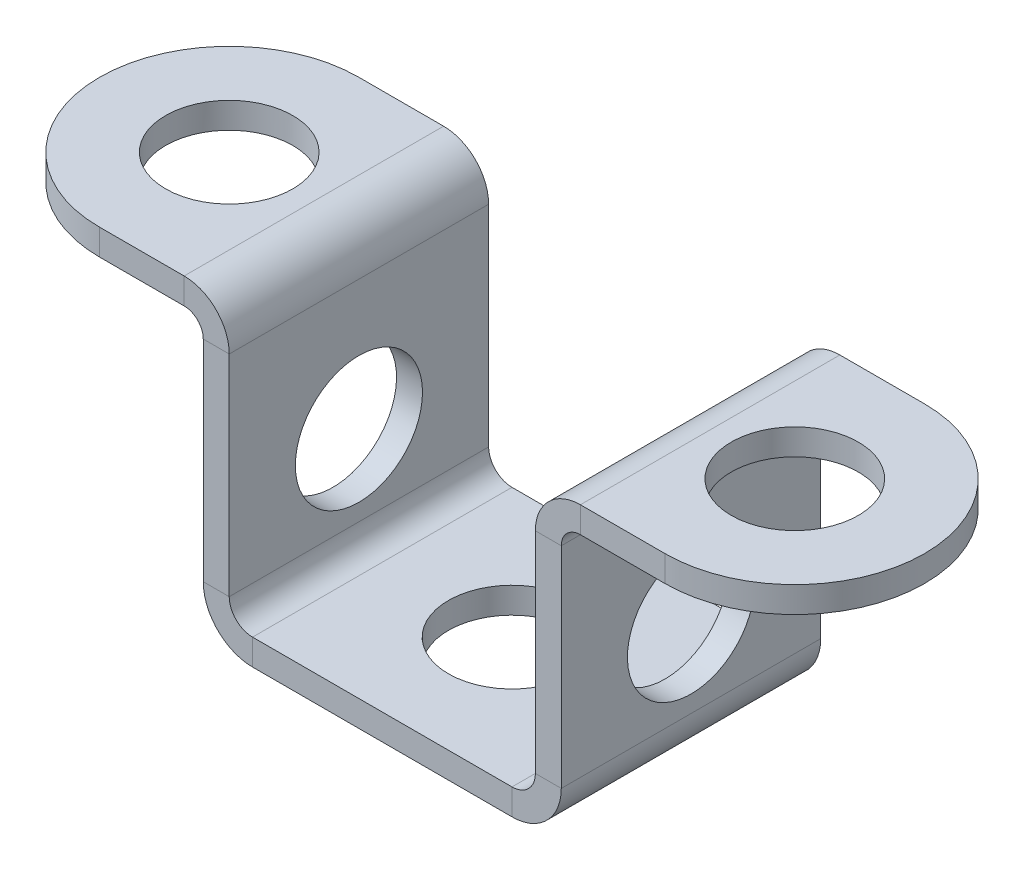
ISO-10303-21;
HEADER;
FILE_DESCRIPTION(('STEP AP214'),'2;1');
FILE_NAME('part.step','',(''),(''),'','','');
FILE_SCHEMA(('AUTOMOTIVE_DESIGN { 1 0 10303 214 1 1 1 1 }'));
ENDSEC;
DATA;
#1=APPLICATION_CONTEXT('core data for automotive mechanical design processes');
#2=APPLICATION_PROTOCOL_DEFINITION('international standard','automotive_design',2000,#1);
#3=PRODUCT_CONTEXT('',#1,'mechanical');
#4=PRODUCT('Part','Part','',(#3));
#5=PRODUCT_RELATED_PRODUCT_CATEGORY('part','',(#4));
#6=PRODUCT_DEFINITION_FORMATION('','',#4);
#7=PRODUCT_DEFINITION_CONTEXT('part definition',#1,'design');
#8=PRODUCT_DEFINITION('design','',#6,#7);
#9=PRODUCT_DEFINITION_SHAPE('','',#8);
#10=(LENGTH_UNIT() NAMED_UNIT(*) SI_UNIT(.MILLI.,.METRE.));
#11=(NAMED_UNIT(*) PLANE_ANGLE_UNIT() SI_UNIT($,.RADIAN.));
#12=(NAMED_UNIT(*) SI_UNIT($,.STERADIAN.) SOLID_ANGLE_UNIT());
#13=UNCERTAINTY_MEASURE_WITH_UNIT(LENGTH_MEASURE(1.E-05),#10,'distance_accuracy_value','');
#14=(GEOMETRIC_REPRESENTATION_CONTEXT(3) GLOBAL_UNCERTAINTY_ASSIGNED_CONTEXT((#13)) GLOBAL_UNIT_ASSIGNED_CONTEXT((#10,
#11,#12)) REPRESENTATION_CONTEXT('',''));
#15=CARTESIAN_POINT('',(0.,0.,0.));
#16=DIRECTION('',(0.,0.,1.));
#17=DIRECTION('',(1.,0.,0.));
#18=AXIS2_PLACEMENT_3D('',#15,#16,#17);
#19=CARTESIAN_POINT('',(0.,11.7366,0.));
#20=DIRECTION('',(0.,1.,0.));
#21=DIRECTION('',(0.,0.,1.));
#22=AXIS2_PLACEMENT_3D('',#19,#20,#21);
#23=PLANE('',#22);
#24=CARTESIAN_POINT('',(10.9,11.7366,0.));
#25=DIRECTION('',(0.,1.,0.));
#26=DIRECTION('',(0.,0.,1.));
#27=AXIS2_PLACEMENT_3D('',#24,#25,#26);
#28=CIRCLE('',#27,2.45);
#29=CARTESIAN_POINT('',(10.9,11.7366,2.45));
#30=VERTEX_POINT('',#29);
#31=EDGE_CURVE('E244',#30,#30,#28,.T.);
#32=ORIENTED_EDGE('',*,*,#31,.F.);
#33=EDGE_LOOP('',(#32));
#34=FACE_BOUND('',#33,.T.);
#35=CARTESIAN_POINT('',(10.9,11.7366,0.));
#36=DIRECTION('',(0.,1.,0.));
#37=DIRECTION('',(0.,0.,1.));
#38=AXIS2_PLACEMENT_3D('',#35,#36,#37);
#39=CIRCLE('',#38,5.);
#40=CARTESIAN_POINT('',(10.9,11.7366,5.));
#41=VERTEX_POINT('',#40);
#42=CARTESIAN_POINT('',(10.9,11.7366,-5.));
#43=VERTEX_POINT('',#42);
#44=EDGE_CURVE('E597',#41,#43,#39,.T.);
#45=ORIENTED_EDGE('',*,*,#44,.T.);
#46=DIRECTION('',(1.,0.,0.));
#47=VECTOR('',#46,1.);
#48=CARTESIAN_POINT('',(15.9,11.7366,-5.));
#49=LINE('',#48,#47);
#50=CARTESIAN_POINT('',(7.63660000000003,11.7366,-5.));
#51=VERTEX_POINT('',#50);
#52=EDGE_CURVE('E294',#51,#43,#49,.T.);
#53=ORIENTED_EDGE('',*,*,#52,.F.);
#54=DIRECTION('',(0.,0.,1.));
#55=VECTOR('',#54,1.);
#56=CARTESIAN_POINT('',(7.63660000000003,11.7366,0.));
#57=LINE('',#56,#55);
#58=CARTESIAN_POINT('',(7.63660000000003,11.7366,5.));
#59=VERTEX_POINT('',#58);
#60=EDGE_CURVE('E303',#51,#59,#57,.T.);
#61=ORIENTED_EDGE('',*,*,#60,.T.);
#62=DIRECTION('',(-1.,0.,0.));
#63=VECTOR('',#62,1.);
#64=CARTESIAN_POINT('',(6.90000000000003,11.7366,5.));
#65=LINE('',#64,#63);
#66=EDGE_CURVE('E290',#41,#59,#65,.T.);
#67=ORIENTED_EDGE('',*,*,#66,.F.);
#68=EDGE_LOOP('',(#45,#53,#61,#67));
#69=FACE_BOUND('',#68,.T.);
#70=ADVANCED_FACE('F121',(#34,#69),#23,.T.);
#71=CARTESIAN_POINT('',(0.,10.7366,0.));
#72=DIRECTION('',(0.,1.,0.));
#73=DIRECTION('',(0.,0.,1.));
#74=AXIS2_PLACEMENT_3D('',#71,#72,#73);
#75=PLANE('',#74);
#76=CARTESIAN_POINT('',(10.9,10.7366,0.));
#77=DIRECTION('',(0.,1.,0.));
#78=DIRECTION('',(0.,0.,1.));
#79=AXIS2_PLACEMENT_3D('',#76,#77,#78);
#80=CIRCLE('',#79,2.45);
#81=CARTESIAN_POINT('',(10.9,10.7366,2.45));
#82=VERTEX_POINT('',#81);
#83=EDGE_CURVE('E125',#82,#82,#80,.T.);
#84=ORIENTED_EDGE('',*,*,#83,.T.);
#85=EDGE_LOOP('',(#84));
#86=FACE_BOUND('',#85,.T.);
#87=DIRECTION('',(-1.,0.,0.));
#88=VECTOR('',#87,1.);
#89=CARTESIAN_POINT('',(0.,10.7366,-5.));
#90=LINE('',#89,#88);
#91=CARTESIAN_POINT('',(7.63660000000003,10.7366,-5.));
#92=VERTEX_POINT('',#91);
#93=CARTESIAN_POINT('',(10.9,10.7366,-5.));
#94=VERTEX_POINT('',#93);
#95=EDGE_CURVE('E300',#92,#94,#90,.F.);
#96=ORIENTED_EDGE('',*,*,#95,.T.);
#97=CARTESIAN_POINT('',(10.9,10.7366,0.));
#98=DIRECTION('',(0.,1.,0.));
#99=DIRECTION('',(0.,0.,1.));
#100=AXIS2_PLACEMENT_3D('',#97,#98,#99);
#101=CIRCLE('',#100,5.);
#102=CARTESIAN_POINT('',(10.9,10.7366,5.));
#103=VERTEX_POINT('',#102);
#104=EDGE_CURVE('E249',#103,#94,#101,.T.);
#105=ORIENTED_EDGE('',*,*,#104,.F.);
#106=DIRECTION('',(1.,0.,0.));
#107=VECTOR('',#106,1.);
#108=CARTESIAN_POINT('',(0.,10.7366,5.));
#109=LINE('',#108,#107);
#110=CARTESIAN_POINT('',(7.63660000000003,10.7366,5.));
#111=VERTEX_POINT('',#110);
#112=EDGE_CURVE('E297',#103,#111,#109,.F.);
#113=ORIENTED_EDGE('',*,*,#112,.T.);
#114=DIRECTION('',(0.,0.,-1.));
#115=VECTOR('',#114,1.);
#116=CARTESIAN_POINT('',(7.63660000000003,10.7366,-5.));
#117=LINE('',#116,#115);
#118=EDGE_CURVE('E309',#92,#111,#117,.F.);
#119=ORIENTED_EDGE('',*,*,#118,.F.);
#120=EDGE_LOOP('',(#96,#105,#113,#119));
#121=FACE_BOUND('',#120,.T.);
#122=ADVANCED_FACE('F592',(#86,#121),#75,.F.);
#123=CARTESIAN_POINT('',(0.,11.7366,0.));
#124=DIRECTION('',(0.,-1.,0.));
#125=DIRECTION('',(0.,0.,-1.));
#126=AXIS2_PLACEMENT_3D('',#123,#124,#125);
#127=PLANE('',#126);
#128=CARTESIAN_POINT('',(-10.9,11.7366,0.));
#129=DIRECTION('',(0.,1.,0.));
#130=DIRECTION('',(0.,0.,1.));
#131=AXIS2_PLACEMENT_3D('',#128,#129,#130);
#132=CIRCLE('',#131,2.45);
#133=CARTESIAN_POINT('',(-10.9,11.7366,2.45));
#134=VERTEX_POINT('',#133);
#135=EDGE_CURVE('E238',#134,#134,#132,.T.);
#136=ORIENTED_EDGE('',*,*,#135,.F.);
#137=EDGE_LOOP('',(#136));
#138=FACE_BOUND('',#137,.T.);
#139=CARTESIAN_POINT('',(-10.9,11.7366,0.));
#140=DIRECTION('',(0.,1.,0.));
#141=DIRECTION('',(0.,0.,1.));
#142=AXIS2_PLACEMENT_3D('',#139,#140,#141);
#143=CIRCLE('',#142,5.);
#144=CARTESIAN_POINT('',(-10.9,11.7366,-5.));
#145=VERTEX_POINT('',#144);
#146=CARTESIAN_POINT('',(-10.9,11.7366,5.));
#147=VERTEX_POINT('',#146);
#148=EDGE_CURVE('E603',#145,#147,#143,.T.);
#149=ORIENTED_EDGE('',*,*,#148,.T.);
#150=DIRECTION('',(1.,0.,0.));
#151=VECTOR('',#150,1.);
#152=CARTESIAN_POINT('',(-6.90000000000003,11.7366,5.));
#153=LINE('',#152,#151);
#154=CARTESIAN_POINT('',(-7.63660000000003,11.7366,5.00000000000001));
#155=VERTEX_POINT('',#154);
#156=EDGE_CURVE('E258',#155,#147,#153,.F.);
#157=ORIENTED_EDGE('',*,*,#156,.F.);
#158=DIRECTION('',(0.,0.,-1.));
#159=VECTOR('',#158,1.);
#160=CARTESIAN_POINT('',(-7.63660000000003,11.7366,5.));
#161=LINE('',#160,#159);
#162=CARTESIAN_POINT('',(-7.63660000000003,11.7366,-5.));
#163=VERTEX_POINT('',#162);
#164=EDGE_CURVE('E267',#163,#155,#161,.F.);
#165=ORIENTED_EDGE('',*,*,#164,.F.);
#166=DIRECTION('',(-1.,0.,0.));
#167=VECTOR('',#166,1.);
#168=CARTESIAN_POINT('',(-15.9,11.7366,-5.));
#169=LINE('',#168,#167);
#170=EDGE_CURVE('E254',#145,#163,#169,.F.);
#171=ORIENTED_EDGE('',*,*,#170,.F.);
#172=EDGE_LOOP('',(#149,#157,#165,#171));
#173=FACE_BOUND('',#172,.T.);
#174=ADVANCED_FACE('F466',(#138,#173),#127,.F.);
#175=CARTESIAN_POINT('',(0.,10.7366,0.));
#176=DIRECTION('',(0.,-1.,0.));
#177=DIRECTION('',(0.,0.,-1.));
#178=AXIS2_PLACEMENT_3D('',#175,#176,#177);
#179=PLANE('',#178);
#180=CARTESIAN_POINT('',(-10.9,10.7366,0.));
#181=DIRECTION('',(0.,-1.,0.));
#182=DIRECTION('',(0.,0.,-1.));
#183=AXIS2_PLACEMENT_3D('',#180,#181,#182);
#184=CIRCLE('',#183,2.45);
#185=CARTESIAN_POINT('',(-10.9,10.7366,-2.45));
#186=VERTEX_POINT('',#185);
#187=EDGE_CURVE('E236',#186,#186,#184,.T.);
#188=ORIENTED_EDGE('',*,*,#187,.F.);
#189=EDGE_LOOP('',(#188));
#190=FACE_BOUND('',#189,.T.);
#191=DIRECTION('',(-1.,0.,0.));
#192=VECTOR('',#191,1.);
#193=CARTESIAN_POINT('',(0.,10.7366,5.));
#194=LINE('',#193,#192);
#195=CARTESIAN_POINT('',(-7.63660000000003,10.7366,5.));
#196=VERTEX_POINT('',#195);
#197=CARTESIAN_POINT('',(-10.9,10.7366,5.));
#198=VERTEX_POINT('',#197);
#199=EDGE_CURVE('E264',#196,#198,#194,.T.);
#200=ORIENTED_EDGE('',*,*,#199,.T.);
#201=CARTESIAN_POINT('',(-10.9,10.7366,0.));
#202=DIRECTION('',(0.,-1.,0.));
#203=DIRECTION('',(0.,0.,-1.));
#204=AXIS2_PLACEMENT_3D('',#201,#202,#203);
#205=CIRCLE('',#204,5.);
#206=CARTESIAN_POINT('',(-10.9,10.7366,-5.));
#207=VERTEX_POINT('',#206);
#208=EDGE_CURVE('E483',#198,#207,#205,.T.);
#209=ORIENTED_EDGE('',*,*,#208,.T.);
#210=DIRECTION('',(1.,0.,0.));
#211=VECTOR('',#210,1.);
#212=CARTESIAN_POINT('',(0.,10.7366,-5.));
#213=LINE('',#212,#211);
#214=CARTESIAN_POINT('',(-7.63660000000003,10.7366,-5.));
#215=VERTEX_POINT('',#214);
#216=EDGE_CURVE('E261',#207,#215,#213,.T.);
#217=ORIENTED_EDGE('',*,*,#216,.T.);
#218=DIRECTION('',(0.,0.,-1.));
#219=VECTOR('',#218,1.);
#220=CARTESIAN_POINT('',(-7.63660000000003,10.7366,5.));
#221=LINE('',#220,#219);
#222=EDGE_CURVE('E273',#196,#215,#221,.T.);
#223=ORIENTED_EDGE('',*,*,#222,.F.);
#224=EDGE_LOOP('',(#200,#209,#217,#223));
#225=FACE_BOUND('',#224,.T.);
#226=ADVANCED_FACE('F480',(#190,#225),#179,.T.);
#227=CARTESIAN_POINT('',(6.90000000000003,11.7366,5.));
#228=DIRECTION('',(0.,0.,1.));
#229=DIRECTION('',(1.,0.,0.));
#230=AXIS2_PLACEMENT_3D('',#227,#228,#229);
#231=PLANE('',#230);
#232=ORIENTED_EDGE('',*,*,#112,.F.);
#233=DIRECTION('',(0.,1.,0.));
#234=VECTOR('',#233,1.);
#235=CARTESIAN_POINT('',(10.9,0.,5.));
#236=LINE('',#235,#234);
#237=EDGE_CURVE('E595',#103,#41,#236,.T.);
#238=ORIENTED_EDGE('',*,*,#237,.T.);
#239=ORIENTED_EDGE('',*,*,#66,.T.);
#240=DIRECTION('',(0.,1.,0.));
#241=VECTOR('',#240,1.);
#242=CARTESIAN_POINT('',(7.63660000000003,10.7366,5.));
#243=LINE('',#242,#241);
#244=EDGE_CURVE('E306',#111,#59,#243,.T.);
#245=ORIENTED_EDGE('',*,*,#244,.F.);
#246=EDGE_LOOP('',(#232,#238,#239,#245));
#247=FACE_BOUND('',#246,.T.);
#248=ADVANCED_FACE('F594',(#247),#231,.T.);
#249=CARTESIAN_POINT('',(-15.9,11.7366,-5.));
#250=DIRECTION('',(0.,0.,-1.));
#251=DIRECTION('',(-1.,0.,0.));
#252=AXIS2_PLACEMENT_3D('',#249,#250,#251);
#253=PLANE('',#252);
#254=ORIENTED_EDGE('',*,*,#216,.F.);
#255=DIRECTION('',(0.,1.,0.));
#256=VECTOR('',#255,1.);
#257=CARTESIAN_POINT('',(-10.9,0.,-5.));
#258=LINE('',#257,#256);
#259=EDGE_CURVE('E599',#207,#145,#258,.T.);
#260=ORIENTED_EDGE('',*,*,#259,.T.);
#261=ORIENTED_EDGE('',*,*,#170,.T.);
#262=DIRECTION('',(0.,1.,0.));
#263=VECTOR('',#262,1.);
#264=CARTESIAN_POINT('',(-7.63660000000003,10.7366,-5.));
#265=LINE('',#264,#263);
#266=EDGE_CURVE('E270',#215,#163,#265,.T.);
#267=ORIENTED_EDGE('',*,*,#266,.F.);
#268=EDGE_LOOP('',(#254,#260,#261,#267));
#269=FACE_BOUND('',#268,.T.);
#270=ADVANCED_FACE('F606',(#269),#253,.T.);
#271=CARTESIAN_POINT('',(0.,1.,0.));
#272=DIRECTION('',(0.,1.,0.));
#273=DIRECTION('',(0.,0.,1.));
#274=AXIS2_PLACEMENT_3D('',#271,#272,#273);
#275=PLANE('',#274);
#276=DIRECTION('',(0.,0.,-1.));
#277=VECTOR('',#276,1.);
#278=CARTESIAN_POINT('',(5.,1.,-5.));
#279=LINE('',#278,#277);
#280=CARTESIAN_POINT('',(5.,1.,5.));
#281=VERTEX_POINT('',#280);
#282=CARTESIAN_POINT('',(5.,1.,-5.));
#283=VERTEX_POINT('',#282);
#284=EDGE_CURVE('E181',#281,#283,#279,.T.);
#285=ORIENTED_EDGE('',*,*,#284,.T.);
#286=DIRECTION('',(-1.,0.,0.));
#287=VECTOR('',#286,1.);
#288=CARTESIAN_POINT('',(-5.,1.,-5.));
#289=LINE('',#288,#287);
#290=CARTESIAN_POINT('',(-5.,1.,-5.));
#291=VERTEX_POINT('',#290);
#292=EDGE_CURVE('E175',#283,#291,#289,.T.);
#293=ORIENTED_EDGE('',*,*,#292,.T.);
#294=DIRECTION('',(0.,0.,1.));
#295=VECTOR('',#294,1.);
#296=CARTESIAN_POINT('',(-5.,1.,-5.));
#297=LINE('',#296,#295);
#298=CARTESIAN_POINT('',(-5.,1.,5.));
#299=VERTEX_POINT('',#298);
#300=EDGE_CURVE('E179',#291,#299,#297,.T.);
#301=ORIENTED_EDGE('',*,*,#300,.T.);
#302=DIRECTION('',(1.,0.,0.));
#303=VECTOR('',#302,1.);
#304=CARTESIAN_POINT('',(-5.,1.,5.));
#305=LINE('',#304,#303);
#306=EDGE_CURVE('E140',#299,#281,#305,.T.);
#307=ORIENTED_EDGE('',*,*,#306,.T.);
#308=EDGE_LOOP('',(#285,#293,#301,#307));
#309=FACE_BOUND('',#308,.T.);
#310=CARTESIAN_POINT('',(0.,1.,0.));
#311=DIRECTION('',(0.,1.,0.));
#312=DIRECTION('',(0.,0.,1.));
#313=AXIS2_PLACEMENT_3D('',#310,#311,#312);
#314=CIRCLE('',#313,2.45);
#315=CARTESIAN_POINT('',(0.,1.,2.45));
#316=VERTEX_POINT('',#315);
#317=EDGE_CURVE('E212',#316,#316,#314,.T.);
#318=ORIENTED_EDGE('',*,*,#317,.F.);
#319=EDGE_LOOP('',(#318));
#320=FACE_BOUND('',#319,.T.);
#321=ADVANCED_FACE('F176',(#309,#320),#275,.T.);
#322=CARTESIAN_POINT('',(0.,0.,0.));
#323=DIRECTION('',(0.,1.,0.));
#324=DIRECTION('',(0.,0.,1.));
#325=AXIS2_PLACEMENT_3D('',#322,#323,#324);
#326=PLANE('',#325);
#327=DIRECTION('',(0.,0.,-1.));
#328=VECTOR('',#327,1.);
#329=CARTESIAN_POINT('',(5.,0.,-5.));
#330=LINE('',#329,#328);
#331=CARTESIAN_POINT('',(5.,0.,5.));
#332=VERTEX_POINT('',#331);
#333=CARTESIAN_POINT('',(5.,0.,-5.));
#334=VERTEX_POINT('',#333);
#335=EDGE_CURVE('E215',#332,#334,#330,.T.);
#336=ORIENTED_EDGE('',*,*,#335,.F.);
#337=DIRECTION('',(1.,0.,0.));
#338=VECTOR('',#337,1.);
#339=CARTESIAN_POINT('',(-5.,0.,5.));
#340=LINE('',#339,#338);
#341=CARTESIAN_POINT('',(-5.,0.,5.));
#342=VERTEX_POINT('',#341);
#343=EDGE_CURVE('E160',#342,#332,#340,.T.);
#344=ORIENTED_EDGE('',*,*,#343,.F.);
#345=DIRECTION('',(0.,0.,1.));
#346=VECTOR('',#345,1.);
#347=CARTESIAN_POINT('',(-5.,0.,-5.));
#348=LINE('',#347,#346);
#349=CARTESIAN_POINT('',(-5.,0.,-5.));
#350=VERTEX_POINT('',#349);
#351=EDGE_CURVE('E225',#350,#342,#348,.T.);
#352=ORIENTED_EDGE('',*,*,#351,.F.);
#353=DIRECTION('',(-1.,0.,0.));
#354=VECTOR('',#353,1.);
#355=CARTESIAN_POINT('',(-5.,0.,-5.));
#356=LINE('',#355,#354);
#357=EDGE_CURVE('E151',#334,#350,#356,.T.);
#358=ORIENTED_EDGE('',*,*,#357,.F.);
#359=EDGE_LOOP('',(#336,#344,#352,#358));
#360=FACE_BOUND('',#359,.T.);
#361=CARTESIAN_POINT('',(0.,0.,0.));
#362=DIRECTION('',(0.,1.,0.));
#363=DIRECTION('',(0.,0.,1.));
#364=AXIS2_PLACEMENT_3D('',#361,#362,#363);
#365=CIRCLE('',#364,2.45);
#366=CARTESIAN_POINT('',(0.,0.,2.45));
#367=VERTEX_POINT('',#366);
#368=EDGE_CURVE('E216',#367,#367,#365,.T.);
#369=ORIENTED_EDGE('',*,*,#368,.T.);
#370=EDGE_LOOP('',(#369));
#371=FACE_BOUND('',#370,.T.);
#372=ADVANCED_FACE('F692',(#360,#371),#326,.F.);
#373=CARTESIAN_POINT('',(-5.,1.,-5.));
#374=DIRECTION('',(0.,0.,1.));
#375=DIRECTION('',(1.,0.,0.));
#376=AXIS2_PLACEMENT_3D('',#373,#374,#375);
#377=PLANE('',#376);
#378=ORIENTED_EDGE('',*,*,#357,.T.);
#379=DIRECTION('',(0.,-1.,0.));
#380=VECTOR('',#379,1.);
#381=CARTESIAN_POINT('',(-5.,1.,-5.));
#382=LINE('',#381,#380);
#383=EDGE_CURVE('E131',#291,#350,#382,.T.);
#384=ORIENTED_EDGE('',*,*,#383,.F.);
#385=ORIENTED_EDGE('',*,*,#292,.F.);
#386=DIRECTION('',(0.,-1.,0.));
#387=VECTOR('',#386,1.);
#388=CARTESIAN_POINT('',(5.,1.,-5.));
#389=LINE('',#388,#387);
#390=EDGE_CURVE('E13',#283,#334,#389,.T.);
#391=ORIENTED_EDGE('',*,*,#390,.T.);
#392=EDGE_LOOP('',(#378,#384,#385,#391));
#393=FACE_BOUND('',#392,.T.);
#394=ADVANCED_FACE('F123',(#393),#377,.F.);
#395=CARTESIAN_POINT('',(-5.,1.,5.));
#396=DIRECTION('',(0.,0.,-1.));
#397=DIRECTION('',(-1.,0.,0.));
#398=AXIS2_PLACEMENT_3D('',#395,#396,#397);
#399=PLANE('',#398);
#400=ORIENTED_EDGE('',*,*,#343,.T.);
#401=DIRECTION('',(0.,-1.,0.));
#402=VECTOR('',#401,1.);
#403=CARTESIAN_POINT('',(5.,1.,5.));
#404=LINE('',#403,#402);
#405=EDGE_CURVE('E221',#281,#332,#404,.T.);
#406=ORIENTED_EDGE('',*,*,#405,.F.);
#407=ORIENTED_EDGE('',*,*,#306,.F.);
#408=DIRECTION('',(0.,-1.,0.));
#409=VECTOR('',#408,1.);
#410=CARTESIAN_POINT('',(-5.,1.,5.));
#411=LINE('',#410,#409);
#412=EDGE_CURVE('E189',#299,#342,#411,.T.);
#413=ORIENTED_EDGE('',*,*,#412,.T.);
#414=EDGE_LOOP('',(#400,#406,#407,#413));
#415=FACE_BOUND('',#414,.T.);
#416=ADVANCED_FACE('F541',(#415),#399,.F.);
#417=CARTESIAN_POINT('',(0.,1.,0.));
#418=DIRECTION('',(0.,-1.,0.));
#419=DIRECTION('',(0.,0.,-1.));
#420=AXIS2_PLACEMENT_3D('',#417,#418,#419);
#421=CYLINDRICAL_SURFACE('',#420,2.45);
#422=ORIENTED_EDGE('',*,*,#317,.T.);
#423=EDGE_LOOP('',(#422));
#424=FACE_BOUND('',#423,.T.);
#425=ORIENTED_EDGE('',*,*,#368,.F.);
#426=EDGE_LOOP('',(#425));
#427=FACE_BOUND('',#426,.T.);
#428=ADVANCED_FACE('F684',(#424,#427),#421,.F.);
#429=CARTESIAN_POINT('',(-5.,1.9,-5.));
#430=DIRECTION('',(0.,0.,-1.));
#431=DIRECTION('',(-1.,0.,0.));
#432=AXIS2_PLACEMENT_3D('',#429,#430,#431);
#433=PLANE('',#432);
#434=DIRECTION('',(-1.,0.,0.));
#435=VECTOR('',#434,1.);
#436=CARTESIAN_POINT('',(-6.9,1.89999999999999,-5.));
#437=LINE('',#436,#435);
#438=CARTESIAN_POINT('',(-5.9,1.9,-5.));
#439=VERTEX_POINT('',#438);
#440=CARTESIAN_POINT('',(-6.9,1.89999999999999,-5.));
#441=VERTEX_POINT('',#440);
#442=EDGE_CURVE('E202',#439,#441,#437,.T.);
#443=ORIENTED_EDGE('',*,*,#442,.F.);
#444=CARTESIAN_POINT('',(-5.,1.9,-5.));
#445=DIRECTION('',(0.,0.,1.));
#446=DIRECTION('',(1.,0.,0.));
#447=AXIS2_PLACEMENT_3D('',#444,#445,#446);
#448=CIRCLE('',#447,0.900000000000001);
#449=EDGE_CURVE('E195',#291,#439,#448,.F.);
#450=ORIENTED_EDGE('',*,*,#449,.F.);
#451=ORIENTED_EDGE('',*,*,#383,.T.);
#452=CARTESIAN_POINT('',(-5.,1.9,-5.));
#453=DIRECTION('',(0.,0.,1.));
#454=DIRECTION('',(1.,0.,0.));
#455=AXIS2_PLACEMENT_3D('',#452,#453,#454);
#456=CIRCLE('',#455,1.9);
#457=EDGE_CURVE('E206',#350,#441,#456,.F.);
#458=ORIENTED_EDGE('',*,*,#457,.T.);
#459=EDGE_LOOP('',(#443,#450,#451,#458));
#460=FACE_BOUND('',#459,.T.);
#461=ADVANCED_FACE('F200',(#460),#433,.T.);
#462=CARTESIAN_POINT('',(-5.,1.9,5.));
#463=DIRECTION('',(0.,0.,-1.));
#464=DIRECTION('',(-1.,0.,0.));
#465=AXIS2_PLACEMENT_3D('',#462,#463,#464);
#466=PLANE('',#465);
#467=CARTESIAN_POINT('',(-5.,1.9,5.));
#468=DIRECTION('',(0.,0.,1.));
#469=DIRECTION('',(1.,0.,0.));
#470=AXIS2_PLACEMENT_3D('',#467,#468,#469);
#471=CIRCLE('',#470,0.900000000000001);
#472=CARTESIAN_POINT('',(-5.9,1.9,5.));
#473=VERTEX_POINT('',#472);
#474=EDGE_CURVE('E198',#473,#299,#471,.T.);
#475=ORIENTED_EDGE('',*,*,#474,.F.);
#476=DIRECTION('',(-1.,0.,0.));
#477=VECTOR('',#476,1.);
#478=CARTESIAN_POINT('',(-5.9,1.9,5.));
#479=LINE('',#478,#477);
#480=CARTESIAN_POINT('',(-6.9,1.89999999999999,5.));
#481=VERTEX_POINT('',#480);
#482=EDGE_CURVE('E406',#473,#481,#479,.T.);
#483=ORIENTED_EDGE('',*,*,#482,.T.);
#484=CARTESIAN_POINT('',(-5.,1.9,5.));
#485=DIRECTION('',(0.,0.,1.));
#486=DIRECTION('',(1.,0.,0.));
#487=AXIS2_PLACEMENT_3D('',#484,#485,#486);
#488=CIRCLE('',#487,1.9);
#489=EDGE_CURVE('E203',#481,#342,#488,.T.);
#490=ORIENTED_EDGE('',*,*,#489,.T.);
#491=ORIENTED_EDGE('',*,*,#412,.F.);
#492=EDGE_LOOP('',(#475,#483,#490,#491));
#493=FACE_BOUND('',#492,.T.);
#494=ADVANCED_FACE('F539',(#493),#466,.F.);
#495=CARTESIAN_POINT('',(-5.,1.9,5.));
#496=DIRECTION('',(0.,0.,1.));
#497=DIRECTION('',(-1.,0.,0.));
#498=AXIS2_PLACEMENT_3D('',#495,#496,#497);
#499=CYLINDRICAL_SURFACE('',#498,1.9);
#500=ORIENTED_EDGE('',*,*,#351,.T.);
#501=ORIENTED_EDGE('',*,*,#489,.F.);
#502=DIRECTION('',(0.,0.,1.));
#503=VECTOR('',#502,1.);
#504=CARTESIAN_POINT('',(-6.9,1.89999999999999,0.));
#505=LINE('',#504,#503);
#506=EDGE_CURVE('E403',#441,#481,#505,.T.);
#507=ORIENTED_EDGE('',*,*,#506,.F.);
#508=ORIENTED_EDGE('',*,*,#457,.F.);
#509=EDGE_LOOP('',(#500,#501,#507,#508));
#510=FACE_BOUND('',#509,.T.);
#511=ADVANCED_FACE('F536',(#510),#499,.T.);
#512=CARTESIAN_POINT('',(-5.,1.9,5.));
#513=DIRECTION('',(0.,0.,1.));
#514=DIRECTION('',(-1.,0.,0.));
#515=AXIS2_PLACEMENT_3D('',#512,#513,#514);
#516=CYLINDRICAL_SURFACE('',#515,0.900000000000001);
#517=ORIENTED_EDGE('',*,*,#300,.F.);
#518=ORIENTED_EDGE('',*,*,#449,.T.);
#519=DIRECTION('',(0.,0.,-1.));
#520=VECTOR('',#519,1.);
#521=CARTESIAN_POINT('',(-5.9,1.9,-5.));
#522=LINE('',#521,#520);
#523=EDGE_CURVE('E409',#439,#473,#522,.F.);
#524=ORIENTED_EDGE('',*,*,#523,.T.);
#525=ORIENTED_EDGE('',*,*,#474,.T.);
#526=EDGE_LOOP('',(#517,#518,#524,#525));
#527=FACE_BOUND('',#526,.T.);
#528=ADVANCED_FACE('F194',(#527),#516,.F.);
#529=CARTESIAN_POINT('',(-6.9,0.999999999999997,5.));
#530=DIRECTION('',(0.,0.,1.));
#531=DIRECTION('',(0.,-1.,0.));
#532=AXIS2_PLACEMENT_3D('',#529,#530,#531);
#533=PLANE('',#532);
#534=DIRECTION('',(0.,-1.,0.));
#535=VECTOR('',#534,1.);
#536=CARTESIAN_POINT('',(-6.9,0.999999999999997,5.));
#537=LINE('',#536,#535);
#538=CARTESIAN_POINT('',(-6.90000000000002,9.99999999999999,5.));
#539=VERTEX_POINT('',#538);
#540=EDGE_CURVE('E385',#539,#481,#537,.T.);
#541=ORIENTED_EDGE('',*,*,#540,.T.);
#542=ORIENTED_EDGE('',*,*,#482,.F.);
#543=DIRECTION('',(0.,1.,0.));
#544=VECTOR('',#543,1.);
#545=CARTESIAN_POINT('',(-5.9,0.,5.));
#546=LINE('',#545,#544);
#547=CARTESIAN_POINT('',(-5.90000000000003,10.,5.));
#548=VERTEX_POINT('',#547);
#549=EDGE_CURVE('E394',#548,#473,#546,.F.);
#550=ORIENTED_EDGE('',*,*,#549,.F.);
#551=DIRECTION('',(1.,0.,0.));
#552=VECTOR('',#551,1.);
#553=CARTESIAN_POINT('',(-6.90000000000003,10.,5.));
#554=LINE('',#553,#552);
#555=EDGE_CURVE('E208',#539,#548,#554,.T.);
#556=ORIENTED_EDGE('',*,*,#555,.F.);
#557=EDGE_LOOP('',(#541,#542,#550,#556));
#558=FACE_BOUND('',#557,.T.);
#559=ADVANCED_FACE('F440',(#558),#533,.T.);
#560=CARTESIAN_POINT('',(-6.90000000000003,10.,-5.));
#561=DIRECTION('',(0.,0.,-1.));
#562=DIRECTION('',(0.,1.,0.));
#563=AXIS2_PLACEMENT_3D('',#560,#561,#562);
#564=PLANE('',#563);
#565=DIRECTION('',(0.,-1.,0.));
#566=VECTOR('',#565,1.);
#567=CARTESIAN_POINT('',(-5.9,0.,-5.));
#568=LINE('',#567,#566);
#569=CARTESIAN_POINT('',(-5.90000000000002,10.,-5.));
#570=VERTEX_POINT('',#569);
#571=EDGE_CURVE('E400',#439,#570,#568,.F.);
#572=ORIENTED_EDGE('',*,*,#571,.F.);
#573=ORIENTED_EDGE('',*,*,#442,.T.);
#574=DIRECTION('',(0.,1.,0.));
#575=VECTOR('',#574,1.);
#576=CARTESIAN_POINT('',(-6.90000000000003,10.,-5.));
#577=LINE('',#576,#575);
#578=CARTESIAN_POINT('',(-6.90000000000002,10.,-5.));
#579=VERTEX_POINT('',#578);
#580=EDGE_CURVE('E391',#441,#579,#577,.T.);
#581=ORIENTED_EDGE('',*,*,#580,.T.);
#582=DIRECTION('',(1.,0.,0.));
#583=VECTOR('',#582,1.);
#584=CARTESIAN_POINT('',(-6.90000000000003,10.,-5.));
#585=LINE('',#584,#583);
#586=EDGE_CURVE('E382',#579,#570,#585,.T.);
#587=ORIENTED_EDGE('',*,*,#586,.T.);
#588=EDGE_LOOP('',(#572,#573,#581,#587));
#589=FACE_BOUND('',#588,.T.);
#590=ADVANCED_FACE('F415',(#589),#564,.T.);
#591=CARTESIAN_POINT('',(-6.9,0.,0.));
#592=DIRECTION('',(-1.,0.,0.));
#593=DIRECTION('',(0.,-1.,0.));
#594=AXIS2_PLACEMENT_3D('',#591,#592,#593);
#595=PLANE('',#594);
#596=CARTESIAN_POINT('',(-6.90000000000005,5.00000000000004,0.));
#597=DIRECTION('',(1.,0.,0.));
#598=DIRECTION('',(0.,1.,0.));
#599=AXIS2_PLACEMENT_3D('',#596,#597,#598);
#600=CIRCLE('',#599,2.45);
#601=CARTESIAN_POINT('',(-6.90000000000004,7.45000000000004,0.));
#602=VERTEX_POINT('',#601);
#603=EDGE_CURVE('E235',#602,#602,#600,.T.);
#604=ORIENTED_EDGE('',*,*,#603,.T.);
#605=EDGE_LOOP('',(#604));
#606=FACE_BOUND('',#605,.T.);
#607=ORIENTED_EDGE('',*,*,#580,.F.);
#608=ORIENTED_EDGE('',*,*,#506,.T.);
#609=ORIENTED_EDGE('',*,*,#540,.F.);
#610=DIRECTION('',(0.,0.,1.));
#611=VECTOR('',#610,1.);
#612=CARTESIAN_POINT('',(-6.90000000000003,10.,5.));
#613=LINE('',#612,#611);
#614=EDGE_CURVE('E388',#579,#539,#613,.T.);
#615=ORIENTED_EDGE('',*,*,#614,.F.);
#616=EDGE_LOOP('',(#607,#608,#609,#615));
#617=FACE_BOUND('',#616,.T.);
#618=ADVANCED_FACE('F419',(#606,#617),#595,.T.);
#619=CARTESIAN_POINT('',(-5.9,0.,0.));
#620=DIRECTION('',(-1.,0.,0.));
#621=DIRECTION('',(0.,-1.,0.));
#622=AXIS2_PLACEMENT_3D('',#619,#620,#621);
#623=PLANE('',#622);
#624=CARTESIAN_POINT('',(-5.90000000000001,5.00000000000003,0.));
#625=DIRECTION('',(-1.,0.,0.));
#626=DIRECTION('',(0.,-1.,0.));
#627=AXIS2_PLACEMENT_3D('',#624,#625,#626);
#628=CIRCLE('',#627,2.45);
#629=CARTESIAN_POINT('',(-5.9,2.55000000000003,0.));
#630=VERTEX_POINT('',#629);
#631=EDGE_CURVE('E234',#630,#630,#628,.T.);
#632=ORIENTED_EDGE('',*,*,#631,.T.);
#633=EDGE_LOOP('',(#632));
#634=FACE_BOUND('',#633,.T.);
#635=ORIENTED_EDGE('',*,*,#523,.F.);
#636=ORIENTED_EDGE('',*,*,#571,.T.);
#637=DIRECTION('',(0.,0.,-1.));
#638=VECTOR('',#637,1.);
#639=CARTESIAN_POINT('',(-5.90000000000003,10.,0.));
#640=LINE('',#639,#638);
#641=EDGE_CURVE('E397',#570,#548,#640,.F.);
#642=ORIENTED_EDGE('',*,*,#641,.T.);
#643=ORIENTED_EDGE('',*,*,#549,.T.);
#644=EDGE_LOOP('',(#635,#636,#642,#643));
#645=FACE_BOUND('',#644,.T.);
#646=ADVANCED_FACE('F445',(#634,#645),#623,.F.);
#647=CARTESIAN_POINT('',(5.,1.9,5.));
#648=DIRECTION('',(0.,0.,1.));
#649=DIRECTION('',(1.,0.,0.));
#650=AXIS2_PLACEMENT_3D('',#647,#648,#649);
#651=PLANE('',#650);
#652=DIRECTION('',(1.,0.,0.));
#653=VECTOR('',#652,1.);
#654=CARTESIAN_POINT('',(6.9,1.89999999999999,5.));
#655=LINE('',#654,#653);
#656=CARTESIAN_POINT('',(5.9,1.9,5.));
#657=VERTEX_POINT('',#656);
#658=CARTESIAN_POINT('',(6.9,1.89999999999999,5.));
#659=VERTEX_POINT('',#658);
#660=EDGE_CURVE('E332',#657,#659,#655,.T.);
#661=ORIENTED_EDGE('',*,*,#660,.F.);
#662=CARTESIAN_POINT('',(5.,1.9,5.));
#663=DIRECTION('',(0.,0.,-1.));
#664=DIRECTION('',(-1.,0.,0.));
#665=AXIS2_PLACEMENT_3D('',#662,#663,#664);
#666=CIRCLE('',#665,0.900000000000001);
#667=EDGE_CURVE('E375',#281,#657,#666,.F.);
#668=ORIENTED_EDGE('',*,*,#667,.F.);
#669=ORIENTED_EDGE('',*,*,#405,.T.);
#670=CARTESIAN_POINT('',(5.,1.9,5.));
#671=DIRECTION('',(0.,0.,-1.));
#672=DIRECTION('',(-1.,0.,0.));
#673=AXIS2_PLACEMENT_3D('',#670,#671,#672);
#674=CIRCLE('',#673,1.9);
#675=EDGE_CURVE('E369',#332,#659,#674,.F.);
#676=ORIENTED_EDGE('',*,*,#675,.T.);
#677=EDGE_LOOP('',(#661,#668,#669,#676));
#678=FACE_BOUND('',#677,.T.);
#679=ADVANCED_FACE('F549',(#678),#651,.T.);
#680=CARTESIAN_POINT('',(5.,1.9,-5.));
#681=DIRECTION('',(0.,0.,1.));
#682=DIRECTION('',(1.,0.,0.));
#683=AXIS2_PLACEMENT_3D('',#680,#681,#682);
#684=PLANE('',#683);
#685=CARTESIAN_POINT('',(5.,1.9,-5.));
#686=DIRECTION('',(0.,0.,-1.));
#687=DIRECTION('',(-1.,0.,0.));
#688=AXIS2_PLACEMENT_3D('',#685,#686,#687);
#689=CIRCLE('',#688,0.900000000000001);
#690=CARTESIAN_POINT('',(5.9,1.9,-5.));
#691=VERTEX_POINT('',#690);
#692=EDGE_CURVE('E336',#691,#283,#689,.T.);
#693=ORIENTED_EDGE('',*,*,#692,.F.);
#694=DIRECTION('',(1.,0.,0.));
#695=VECTOR('',#694,1.);
#696=CARTESIAN_POINT('',(5.9,1.9,-5.));
#697=LINE('',#696,#695);
#698=CARTESIAN_POINT('',(6.9,1.89999999999999,-5.));
#699=VERTEX_POINT('',#698);
#700=EDGE_CURVE('E361',#691,#699,#697,.T.);
#701=ORIENTED_EDGE('',*,*,#700,.T.);
#702=CARTESIAN_POINT('',(5.,1.9,-5.));
#703=DIRECTION('',(0.,0.,-1.));
#704=DIRECTION('',(-1.,0.,0.));
#705=AXIS2_PLACEMENT_3D('',#702,#703,#704);
#706=CIRCLE('',#705,1.9);
#707=EDGE_CURVE('E372',#699,#334,#706,.T.);
#708=ORIENTED_EDGE('',*,*,#707,.T.);
#709=ORIENTED_EDGE('',*,*,#390,.F.);
#710=EDGE_LOOP('',(#693,#701,#708,#709));
#711=FACE_BOUND('',#710,.T.);
#712=ADVANCED_FACE('F659',(#711),#684,.F.);
#713=CARTESIAN_POINT('',(5.,1.9,-5.));
#714=DIRECTION('',(0.,0.,-1.));
#715=DIRECTION('',(1.,0.,0.));
#716=AXIS2_PLACEMENT_3D('',#713,#714,#715);
#717=CYLINDRICAL_SURFACE('',#716,1.9);
#718=ORIENTED_EDGE('',*,*,#335,.T.);
#719=ORIENTED_EDGE('',*,*,#707,.F.);
#720=DIRECTION('',(0.,0.,-1.));
#721=VECTOR('',#720,1.);
#722=CARTESIAN_POINT('',(6.9,1.89999999999999,5.));
#723=LINE('',#722,#721);
#724=EDGE_CURVE('E358',#699,#659,#723,.F.);
#725=ORIENTED_EDGE('',*,*,#724,.T.);
#726=ORIENTED_EDGE('',*,*,#675,.F.);
#727=EDGE_LOOP('',(#718,#719,#725,#726));
#728=FACE_BOUND('',#727,.T.);
#729=ADVANCED_FACE('F656',(#728),#717,.T.);
#730=CARTESIAN_POINT('',(5.,1.9,-5.));
#731=DIRECTION('',(0.,0.,-1.));
#732=DIRECTION('',(1.,0.,0.));
#733=AXIS2_PLACEMENT_3D('',#730,#731,#732);
#734=CYLINDRICAL_SURFACE('',#733,0.900000000000001);
#735=ORIENTED_EDGE('',*,*,#284,.F.);
#736=ORIENTED_EDGE('',*,*,#667,.T.);
#737=DIRECTION('',(0.,0.,-1.));
#738=VECTOR('',#737,1.);
#739=CARTESIAN_POINT('',(5.9,1.9,5.));
#740=LINE('',#739,#738);
#741=EDGE_CURVE('E364',#657,#691,#740,.T.);
#742=ORIENTED_EDGE('',*,*,#741,.T.);
#743=ORIENTED_EDGE('',*,*,#692,.T.);
#744=EDGE_LOOP('',(#735,#736,#742,#743));
#745=FACE_BOUND('',#744,.T.);
#746=ADVANCED_FACE('F546',(#745),#734,.F.);
#747=CARTESIAN_POINT('',(6.9,0.999999999999997,5.));
#748=DIRECTION('',(0.,0.,1.));
#749=DIRECTION('',(1.,0.,0.));
#750=AXIS2_PLACEMENT_3D('',#747,#748,#749);
#751=PLANE('',#750);
#752=DIRECTION('',(0.,1.,0.));
#753=VECTOR('',#752,1.);
#754=CARTESIAN_POINT('',(5.89999999999999,0.,5.));
#755=LINE('',#754,#753);
#756=CARTESIAN_POINT('',(5.90000000000003,10.,5.));
#757=VERTEX_POINT('',#756);
#758=EDGE_CURVE('E355',#657,#757,#755,.T.);
#759=ORIENTED_EDGE('',*,*,#758,.F.);
#760=ORIENTED_EDGE('',*,*,#660,.T.);
#761=DIRECTION('',(0.,-1.,0.));
#762=VECTOR('',#761,1.);
#763=CARTESIAN_POINT('',(6.9,0.999999999999997,5.));
#764=LINE('',#763,#762);
#765=CARTESIAN_POINT('',(6.90000000000003,10.,5.));
#766=VERTEX_POINT('',#765);
#767=EDGE_CURVE('E346',#659,#766,#764,.F.);
#768=ORIENTED_EDGE('',*,*,#767,.T.);
#769=DIRECTION('',(-1.,0.,0.));
#770=VECTOR('',#769,1.);
#771=CARTESIAN_POINT('',(6.90000000000003,10.,5.));
#772=LINE('',#771,#770);
#773=EDGE_CURVE('E337',#766,#757,#772,.T.);
#774=ORIENTED_EDGE('',*,*,#773,.T.);
#775=EDGE_LOOP('',(#759,#760,#768,#774));
#776=FACE_BOUND('',#775,.T.);
#777=ADVANCED_FACE('F553',(#776),#751,.T.);
#778=CARTESIAN_POINT('',(6.90000000000003,10.,-5.));
#779=DIRECTION('',(0.,0.,-1.));
#780=DIRECTION('',(-1.,0.,0.));
#781=AXIS2_PLACEMENT_3D('',#778,#779,#780);
#782=PLANE('',#781);
#783=DIRECTION('',(0.,1.,0.));
#784=VECTOR('',#783,1.);
#785=CARTESIAN_POINT('',(6.90000000000003,10.,-5.));
#786=LINE('',#785,#784);
#787=CARTESIAN_POINT('',(6.90000000000003,10.,-5.));
#788=VERTEX_POINT('',#787);
#789=EDGE_CURVE('E340',#788,#699,#786,.F.);
#790=ORIENTED_EDGE('',*,*,#789,.T.);
#791=ORIENTED_EDGE('',*,*,#700,.F.);
#792=DIRECTION('',(0.,-1.,0.));
#793=VECTOR('',#792,1.);
#794=CARTESIAN_POINT('',(5.89999999999999,0.,-5.));
#795=LINE('',#794,#793);
#796=CARTESIAN_POINT('',(5.90000000000003,10.,-5.));
#797=VERTEX_POINT('',#796);
#798=EDGE_CURVE('E349',#797,#691,#795,.T.);
#799=ORIENTED_EDGE('',*,*,#798,.F.);
#800=DIRECTION('',(-1.,0.,0.));
#801=VECTOR('',#800,1.);
#802=CARTESIAN_POINT('',(6.90000000000003,10.,-5.));
#803=LINE('',#802,#801);
#804=EDGE_CURVE('E333',#788,#797,#803,.T.);
#805=ORIENTED_EDGE('',*,*,#804,.F.);
#806=EDGE_LOOP('',(#790,#791,#799,#805));
#807=FACE_BOUND('',#806,.T.);
#808=ADVANCED_FACE('F569',(#807),#782,.T.);
#809=CARTESIAN_POINT('',(6.89999999999999,0.,0.));
#810=DIRECTION('',(-1.,0.,0.));
#811=DIRECTION('',(0.,-1.,0.));
#812=AXIS2_PLACEMENT_3D('',#809,#810,#811);
#813=PLANE('',#812);
#814=CARTESIAN_POINT('',(6.90000000000001,4.99999999999999,0.));
#815=DIRECTION('',(1.,0.,0.));
#816=DIRECTION('',(0.,1.,0.));
#817=AXIS2_PLACEMENT_3D('',#814,#815,#816);
#818=CIRCLE('',#817,2.45);
#819=CARTESIAN_POINT('',(6.90000000000002,7.44999999999999,0.));
#820=VERTEX_POINT('',#819);
#821=EDGE_CURVE('E317',#820,#820,#818,.T.);
#822=ORIENTED_EDGE('',*,*,#821,.F.);
#823=EDGE_LOOP('',(#822));
#824=FACE_BOUND('',#823,.T.);
#825=ORIENTED_EDGE('',*,*,#724,.F.);
#826=ORIENTED_EDGE('',*,*,#789,.F.);
#827=DIRECTION('',(0.,0.,1.));
#828=VECTOR('',#827,1.);
#829=CARTESIAN_POINT('',(6.90000000000003,10.,5.));
#830=LINE('',#829,#828);
#831=EDGE_CURVE('E343',#766,#788,#830,.F.);
#832=ORIENTED_EDGE('',*,*,#831,.F.);
#833=ORIENTED_EDGE('',*,*,#767,.F.);
#834=EDGE_LOOP('',(#825,#826,#832,#833));
#835=FACE_BOUND('',#834,.T.);
#836=ADVANCED_FACE('F557',(#824,#835),#813,.F.);
#837=CARTESIAN_POINT('',(5.89999999999999,0.,0.));
#838=DIRECTION('',(-1.,0.,0.));
#839=DIRECTION('',(0.,-1.,0.));
#840=AXIS2_PLACEMENT_3D('',#837,#838,#839);
#841=PLANE('',#840);
#842=CARTESIAN_POINT('',(5.90000000000001,4.99999999999999,0.));
#843=DIRECTION('',(-1.,0.,0.));
#844=DIRECTION('',(0.,-1.,0.));
#845=AXIS2_PLACEMENT_3D('',#842,#843,#844);
#846=CIRCLE('',#845,2.45);
#847=CARTESIAN_POINT('',(5.9,2.54999999999999,0.));
#848=VERTEX_POINT('',#847);
#849=EDGE_CURVE('E232',#848,#848,#846,.T.);
#850=ORIENTED_EDGE('',*,*,#849,.F.);
#851=EDGE_LOOP('',(#850));
#852=FACE_BOUND('',#851,.T.);
#853=ORIENTED_EDGE('',*,*,#798,.T.);
#854=ORIENTED_EDGE('',*,*,#741,.F.);
#855=ORIENTED_EDGE('',*,*,#758,.T.);
#856=DIRECTION('',(0.,0.,-1.));
#857=VECTOR('',#856,1.);
#858=CARTESIAN_POINT('',(5.90000000000003,10.,0.));
#859=LINE('',#858,#857);
#860=EDGE_CURVE('E352',#757,#797,#859,.T.);
#861=ORIENTED_EDGE('',*,*,#860,.T.);
#862=EDGE_LOOP('',(#853,#854,#855,#861));
#863=FACE_BOUND('',#862,.T.);
#864=ADVANCED_FACE('F572',(#852,#863),#841,.T.);
#865=CARTESIAN_POINT('',(-6.90000000000005,5.00000000000004,0.));
#866=DIRECTION('',(1.,0.,0.));
#867=DIRECTION('',(0.,1.,0.));
#868=AXIS2_PLACEMENT_3D('',#865,#866,#867);
#869=CYLINDRICAL_SURFACE('',#868,2.45);
#870=ORIENTED_EDGE('',*,*,#849,.T.);
#871=EDGE_LOOP('',(#870));
#872=FACE_BOUND('',#871,.T.);
#873=ORIENTED_EDGE('',*,*,#821,.T.);
#874=EDGE_LOOP('',(#873));
#875=FACE_BOUND('',#874,.T.);
#876=ADVANCED_FACE('F642',(#872,#875),#869,.F.);
#877=ORIENTED_EDGE('',*,*,#603,.F.);
#878=EDGE_LOOP('',(#877));
#879=FACE_BOUND('',#878,.T.);
#880=ORIENTED_EDGE('',*,*,#631,.F.);
#881=EDGE_LOOP('',(#880));
#882=FACE_BOUND('',#881,.T.);
#883=ADVANCED_FACE('F639',(#879,#882),#869,.F.);
#884=CARTESIAN_POINT('',(7.63660000000003,10.,-5.));
#885=DIRECTION('',(0.,0.,-1.));
#886=DIRECTION('',(0.,1.,0.));
#887=AXIS2_PLACEMENT_3D('',#884,#885,#886);
#888=PLANE('',#887);
#889=DIRECTION('',(0.,1.,0.));
#890=VECTOR('',#889,1.);
#891=CARTESIAN_POINT('',(7.63660000000002,11.7366,-5.));
#892=LINE('',#891,#890);
#893=EDGE_CURVE('E281',#92,#51,#892,.T.);
#894=ORIENTED_EDGE('',*,*,#893,.F.);
#895=CARTESIAN_POINT('',(7.63660000000003,10.,-5.));
#896=DIRECTION('',(0.,0.,1.));
#897=DIRECTION('',(0.,-1.,0.));
#898=AXIS2_PLACEMENT_3D('',#895,#896,#897);
#899=CIRCLE('',#898,0.736599999999993);
#900=EDGE_CURVE('E321',#788,#92,#899,.F.);
#901=ORIENTED_EDGE('',*,*,#900,.F.);
#902=ORIENTED_EDGE('',*,*,#804,.T.);
#903=CARTESIAN_POINT('',(7.63660000000003,10.,-5.));
#904=DIRECTION('',(0.,0.,1.));
#905=DIRECTION('',(0.,-1.,0.));
#906=AXIS2_PLACEMENT_3D('',#903,#904,#905);
#907=CIRCLE('',#906,1.73659999999999);
#908=EDGE_CURVE('E314',#797,#51,#907,.F.);
#909=ORIENTED_EDGE('',*,*,#908,.T.);
#910=EDGE_LOOP('',(#894,#901,#902,#909));
#911=FACE_BOUND('',#910,.T.);
#912=ADVANCED_FACE('F566',(#911),#888,.T.);
#913=CARTESIAN_POINT('',(7.63660000000003,9.99999999999999,5.));
#914=DIRECTION('',(0.,0.,-1.));
#915=DIRECTION('',(0.,1.,0.));
#916=AXIS2_PLACEMENT_3D('',#913,#914,#915);
#917=PLANE('',#916);
#918=CARTESIAN_POINT('',(7.63660000000003,9.99999999999999,5.));
#919=DIRECTION('',(0.,0.,1.));
#920=DIRECTION('',(0.,-1.,0.));
#921=AXIS2_PLACEMENT_3D('',#918,#919,#920);
#922=CIRCLE('',#921,0.736599999999993);
#923=EDGE_CURVE('E293',#111,#766,#922,.T.);
#924=ORIENTED_EDGE('',*,*,#923,.F.);
#925=ORIENTED_EDGE('',*,*,#244,.T.);
#926=CARTESIAN_POINT('',(7.63660000000003,9.99999999999999,5.));
#927=DIRECTION('',(0.,0.,1.));
#928=DIRECTION('',(0.,-1.,0.));
#929=AXIS2_PLACEMENT_3D('',#926,#927,#928);
#930=CIRCLE('',#929,1.73659999999999);
#931=EDGE_CURVE('E318',#59,#757,#930,.T.);
#932=ORIENTED_EDGE('',*,*,#931,.T.);
#933=ORIENTED_EDGE('',*,*,#773,.F.);
#934=EDGE_LOOP('',(#924,#925,#932,#933));
#935=FACE_BOUND('',#934,.T.);
#936=ADVANCED_FACE('F577',(#935),#917,.F.);
#937=CARTESIAN_POINT('',(7.63660000000003,9.99999999999999,5.));
#938=DIRECTION('',(0.,0.,1.));
#939=DIRECTION('',(0.,1.,0.));
#940=AXIS2_PLACEMENT_3D('',#937,#938,#939);
#941=CYLINDRICAL_SURFACE('',#940,1.73659999999999);
#942=ORIENTED_EDGE('',*,*,#860,.F.);
#943=ORIENTED_EDGE('',*,*,#931,.F.);
#944=ORIENTED_EDGE('',*,*,#60,.F.);
#945=ORIENTED_EDGE('',*,*,#908,.F.);
#946=EDGE_LOOP('',(#942,#943,#944,#945));
#947=FACE_BOUND('',#946,.T.);
#948=ADVANCED_FACE('F575',(#947),#941,.T.);
#949=CARTESIAN_POINT('',(7.63660000000003,9.99999999999999,5.));
#950=DIRECTION('',(0.,0.,1.));
#951=DIRECTION('',(0.,1.,0.));
#952=AXIS2_PLACEMENT_3D('',#949,#950,#951);
#953=CYLINDRICAL_SURFACE('',#952,0.736599999999993);
#954=ORIENTED_EDGE('',*,*,#831,.T.);
#955=ORIENTED_EDGE('',*,*,#900,.T.);
#956=ORIENTED_EDGE('',*,*,#118,.T.);
#957=ORIENTED_EDGE('',*,*,#923,.T.);
#958=EDGE_LOOP('',(#954,#955,#956,#957));
#959=FACE_BOUND('',#958,.T.);
#960=ADVANCED_FACE('F561',(#959),#953,.F.);
#961=CARTESIAN_POINT('',(15.9,11.7366,-5.));
#962=DIRECTION('',(0.,0.,-1.));
#963=DIRECTION('',(-1.,0.,0.));
#964=AXIS2_PLACEMENT_3D('',#961,#962,#963);
#965=PLANE('',#964);
#966=DIRECTION('',(0.,1.,0.));
#967=VECTOR('',#966,1.);
#968=CARTESIAN_POINT('',(10.9,0.,-5.));
#969=LINE('',#968,#967);
#970=EDGE_CURVE('E589',#94,#43,#969,.T.);
#971=ORIENTED_EDGE('',*,*,#970,.F.);
#972=ORIENTED_EDGE('',*,*,#95,.F.);
#973=ORIENTED_EDGE('',*,*,#893,.T.);
#974=ORIENTED_EDGE('',*,*,#52,.T.);
#975=EDGE_LOOP('',(#971,#972,#973,#974));
#976=FACE_BOUND('',#975,.T.);
#977=ADVANCED_FACE('F587',(#976),#965,.T.);
#978=CARTESIAN_POINT('',(-7.63660000000003,9.99999999999999,5.));
#979=DIRECTION('',(0.,0.,1.));
#980=DIRECTION('',(0.,-1.,0.));
#981=AXIS2_PLACEMENT_3D('',#978,#979,#980);
#982=PLANE('',#981);
#983=DIRECTION('',(0.,1.,0.));
#984=VECTOR('',#983,1.);
#985=CARTESIAN_POINT('',(-7.63660000000003,11.7366,5.));
#986=LINE('',#985,#984);
#987=EDGE_CURVE('E242',#196,#155,#986,.T.);
#988=ORIENTED_EDGE('',*,*,#987,.F.);
#989=CARTESIAN_POINT('',(-7.63660000000003,9.99999999999999,5.));
#990=DIRECTION('',(0.,0.,-1.));
#991=DIRECTION('',(0.,1.,0.));
#992=AXIS2_PLACEMENT_3D('',#989,#990,#991);
#993=CIRCLE('',#992,0.736600000000006);
#994=EDGE_CURVE('E285',#539,#196,#993,.F.);
#995=ORIENTED_EDGE('',*,*,#994,.F.);
#996=ORIENTED_EDGE('',*,*,#555,.T.);
#997=CARTESIAN_POINT('',(-7.63660000000003,9.99999999999999,5.));
#998=DIRECTION('',(0.,0.,-1.));
#999=DIRECTION('',(0.,1.,0.));
#1000=AXIS2_PLACEMENT_3D('',#997,#998,#999);
#1001=CIRCLE('',#1000,1.73660000000001);
#1002=EDGE_CURVE('E278',#548,#155,#1001,.F.);
#1003=ORIENTED_EDGE('',*,*,#1002,.T.);
#1004=EDGE_LOOP('',(#988,#995,#996,#1003));
#1005=FACE_BOUND('',#1004,.T.);
#1006=ADVANCED_FACE('F436',(#1005),#982,.T.);
#1007=CARTESIAN_POINT('',(-7.63660000000003,10.,-5.));
#1008=DIRECTION('',(0.,0.,1.));
#1009=DIRECTION('',(0.,-1.,0.));
#1010=AXIS2_PLACEMENT_3D('',#1007,#1008,#1009);
#1011=PLANE('',#1010);
#1012=CARTESIAN_POINT('',(-7.63660000000003,10.,-5.));
#1013=DIRECTION('',(0.,0.,-1.));
#1014=DIRECTION('',(0.,1.,0.));
#1015=AXIS2_PLACEMENT_3D('',#1012,#1013,#1014);
#1016=CIRCLE('',#1015,0.736600000000006);
#1017=EDGE_CURVE('E257',#215,#579,#1016,.T.);
#1018=ORIENTED_EDGE('',*,*,#1017,.F.);
#1019=ORIENTED_EDGE('',*,*,#266,.T.);
#1020=CARTESIAN_POINT('',(-7.63660000000003,10.,-5.));
#1021=DIRECTION('',(0.,0.,-1.));
#1022=DIRECTION('',(0.,1.,0.));
#1023=AXIS2_PLACEMENT_3D('',#1020,#1021,#1022);
#1024=CIRCLE('',#1023,1.73660000000001);
#1025=EDGE_CURVE('E282',#163,#570,#1024,.T.);
#1026=ORIENTED_EDGE('',*,*,#1025,.T.);
#1027=ORIENTED_EDGE('',*,*,#586,.F.);
#1028=EDGE_LOOP('',(#1018,#1019,#1026,#1027));
#1029=FACE_BOUND('',#1028,.T.);
#1030=ADVANCED_FACE('F455',(#1029),#1011,.F.);
#1031=CARTESIAN_POINT('',(-7.63660000000003,10.,-5.));
#1032=DIRECTION('',(0.,0.,-1.));
#1033=DIRECTION('',(0.,1.,0.));
#1034=AXIS2_PLACEMENT_3D('',#1031,#1032,#1033);
#1035=CYLINDRICAL_SURFACE('',#1034,1.73660000000001);
#1036=ORIENTED_EDGE('',*,*,#641,.F.);
#1037=ORIENTED_EDGE('',*,*,#1025,.F.);
#1038=ORIENTED_EDGE('',*,*,#164,.T.);
#1039=ORIENTED_EDGE('',*,*,#1002,.F.);
#1040=EDGE_LOOP('',(#1036,#1037,#1038,#1039));
#1041=FACE_BOUND('',#1040,.T.);
#1042=ADVANCED_FACE('F450',(#1041),#1035,.T.);
#1043=CARTESIAN_POINT('',(-7.63660000000003,10.,-5.));
#1044=DIRECTION('',(0.,0.,-1.));
#1045=DIRECTION('',(0.,1.,0.));
#1046=AXIS2_PLACEMENT_3D('',#1043,#1044,#1045);
#1047=CYLINDRICAL_SURFACE('',#1046,0.736600000000006);
#1048=ORIENTED_EDGE('',*,*,#614,.T.);
#1049=ORIENTED_EDGE('',*,*,#994,.T.);
#1050=ORIENTED_EDGE('',*,*,#222,.T.);
#1051=ORIENTED_EDGE('',*,*,#1017,.T.);
#1052=EDGE_LOOP('',(#1048,#1049,#1050,#1051));
#1053=FACE_BOUND('',#1052,.T.);
#1054=ADVANCED_FACE('F427',(#1053),#1047,.F.);
#1055=CARTESIAN_POINT('',(-6.90000000000003,11.7366,5.));
#1056=DIRECTION('',(0.,0.,1.));
#1057=DIRECTION('',(1.,0.,0.));
#1058=AXIS2_PLACEMENT_3D('',#1055,#1056,#1057);
#1059=PLANE('',#1058);
#1060=DIRECTION('',(0.,1.,0.));
#1061=VECTOR('',#1060,1.);
#1062=CARTESIAN_POINT('',(-10.9,0.,5.));
#1063=LINE('',#1062,#1061);
#1064=EDGE_CURVE('E476',#198,#147,#1063,.T.);
#1065=ORIENTED_EDGE('',*,*,#1064,.F.);
#1066=ORIENTED_EDGE('',*,*,#199,.F.);
#1067=ORIENTED_EDGE('',*,*,#987,.T.);
#1068=ORIENTED_EDGE('',*,*,#156,.T.);
#1069=EDGE_LOOP('',(#1065,#1066,#1067,#1068));
#1070=FACE_BOUND('',#1069,.T.);
#1071=ADVANCED_FACE('F472',(#1070),#1059,.T.);
#1072=CARTESIAN_POINT('',(-10.9,0.,0.));
#1073=DIRECTION('',(0.,1.,0.));
#1074=DIRECTION('',(0.,0.,1.));
#1075=AXIS2_PLACEMENT_3D('',#1072,#1073,#1074);
#1076=CYLINDRICAL_SURFACE('',#1075,2.45);
#1077=ORIENTED_EDGE('',*,*,#187,.T.);
#1078=EDGE_LOOP('',(#1077));
#1079=FACE_BOUND('',#1078,.T.);
#1080=ORIENTED_EDGE('',*,*,#135,.T.);
#1081=EDGE_LOOP('',(#1080));
#1082=FACE_BOUND('',#1081,.T.);
#1083=ADVANCED_FACE('F754',(#1079,#1082),#1076,.F.);
#1084=CARTESIAN_POINT('',(10.9,0.,0.));
#1085=DIRECTION('',(0.,1.,0.));
#1086=DIRECTION('',(0.,0.,1.));
#1087=AXIS2_PLACEMENT_3D('',#1084,#1085,#1086);
#1088=CYLINDRICAL_SURFACE('',#1087,2.45);
#1089=ORIENTED_EDGE('',*,*,#31,.T.);
#1090=EDGE_LOOP('',(#1089));
#1091=FACE_BOUND('',#1090,.T.);
#1092=ORIENTED_EDGE('',*,*,#83,.F.);
#1093=EDGE_LOOP('',(#1092));
#1094=FACE_BOUND('',#1093,.T.);
#1095=ADVANCED_FACE('F615',(#1091,#1094),#1088,.F.);
#1096=CARTESIAN_POINT('',(-10.9,0.,0.));
#1097=DIRECTION('',(0.,1.,0.));
#1098=DIRECTION('',(0.,0.,1.));
#1099=AXIS2_PLACEMENT_3D('',#1096,#1097,#1098);
#1100=CYLINDRICAL_SURFACE('',#1099,5.);
#1101=ORIENTED_EDGE('',*,*,#208,.F.);
#1102=ORIENTED_EDGE('',*,*,#1064,.T.);
#1103=ORIENTED_EDGE('',*,*,#148,.F.);
#1104=ORIENTED_EDGE('',*,*,#259,.F.);
#1105=EDGE_LOOP('',(#1101,#1102,#1103,#1104));
#1106=FACE_BOUND('',#1105,.T.);
#1107=ADVANCED_FACE('F607',(#1106),#1100,.T.);
#1108=CARTESIAN_POINT('',(10.9,0.,0.));
#1109=DIRECTION('',(0.,1.,0.));
#1110=DIRECTION('',(0.,0.,1.));
#1111=AXIS2_PLACEMENT_3D('',#1108,#1109,#1110);
#1112=CYLINDRICAL_SURFACE('',#1111,5.);
#1113=ORIENTED_EDGE('',*,*,#104,.T.);
#1114=ORIENTED_EDGE('',*,*,#970,.T.);
#1115=ORIENTED_EDGE('',*,*,#44,.F.);
#1116=ORIENTED_EDGE('',*,*,#237,.F.);
#1117=EDGE_LOOP('',(#1113,#1114,#1115,#1116));
#1118=FACE_BOUND('',#1117,.T.);
#1119=ADVANCED_FACE('F609',(#1118),#1112,.T.);
#1120=CLOSED_SHELL('',(#70,#122,#174,#226,#248,#270,#321,#372,#394,#416,#428,#461,#494,#511,
#528,#559,#590,#618,#646,#679,#712,#729,#746,#777,#808,#836,#864,#876,#883,#912,#936,#948,#960,
#977,#1006,#1030,#1042,#1054,#1071,#1083,#1095,#1107,#1119));
#1121=MANIFOLD_SOLID_BREP('B2',#1120);
#1122=ADVANCED_BREP_SHAPE_REPRESENTATION('',(#18,#1121),#14);
#1123=SHAPE_DEFINITION_REPRESENTATION(#9,#1122);
ENDSEC;
END-ISO-10303-21;
